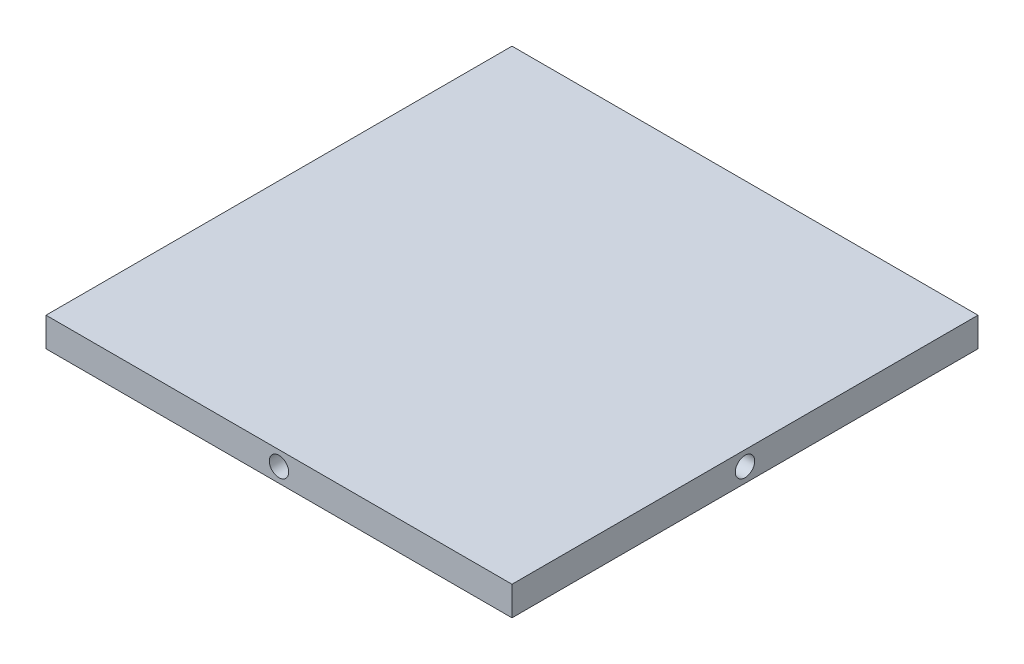
ISO-10303-21;
HEADER;
FILE_DESCRIPTION(('STEP AP214'),'2;1');
FILE_NAME('part.step','',(''),(''),'','','');
FILE_SCHEMA(('AUTOMOTIVE_DESIGN { 1 0 10303 214 1 1 1 1 }'));
ENDSEC;
DATA;
#1=APPLICATION_CONTEXT('core data for automotive mechanical design processes');
#2=APPLICATION_PROTOCOL_DEFINITION('international standard','automotive_design',2000,#1);
#3=PRODUCT_CONTEXT('',#1,'mechanical');
#4=PRODUCT('Part','Part','',(#3));
#5=PRODUCT_RELATED_PRODUCT_CATEGORY('part','',(#4));
#6=PRODUCT_DEFINITION_FORMATION('','',#4);
#7=PRODUCT_DEFINITION_CONTEXT('part definition',#1,'design');
#8=PRODUCT_DEFINITION('design','',#6,#7);
#9=PRODUCT_DEFINITION_SHAPE('','',#8);
#10=(LENGTH_UNIT() NAMED_UNIT(*) SI_UNIT(.MILLI.,.METRE.));
#11=(NAMED_UNIT(*) PLANE_ANGLE_UNIT() SI_UNIT($,.RADIAN.));
#12=(NAMED_UNIT(*) SI_UNIT($,.STERADIAN.) SOLID_ANGLE_UNIT());
#13=UNCERTAINTY_MEASURE_WITH_UNIT(LENGTH_MEASURE(1.E-05),#10,'distance_accuracy_value','');
#14=(GEOMETRIC_REPRESENTATION_CONTEXT(3) GLOBAL_UNCERTAINTY_ASSIGNED_CONTEXT((#13)) GLOBAL_UNIT_ASSIGNED_CONTEXT((#10,
#11,#12)) REPRESENTATION_CONTEXT('',''));
#15=CARTESIAN_POINT('',(0.,0.,0.));
#16=DIRECTION('',(0.,0.,1.));
#17=DIRECTION('',(1.,0.,0.));
#18=AXIS2_PLACEMENT_3D('',#15,#16,#17);
#19=CARTESIAN_POINT('',(76.2,4.7625,76.2));
#20=DIRECTION('',(-1.,0.,0.));
#21=DIRECTION('',(0.,0.,1.));
#22=AXIS2_PLACEMENT_3D('',#19,#20,#21);
#23=PLANE('',#22);
#24=CARTESIAN_POINT('',(76.2,0.,0.));
#25=DIRECTION('',(1.,0.,0.));
#26=DIRECTION('',(0.,0.,-1.));
#27=AXIS2_PLACEMENT_3D('',#24,#25,#26);
#28=CIRCLE('',#27,3.17499999999999);
#29=CARTESIAN_POINT('',(76.2,0.,-3.17499999999999));
#30=VERTEX_POINT('',#29);
#31=EDGE_CURVE('E121',#30,#30,#28,.T.);
#32=ORIENTED_EDGE('',*,*,#31,.F.);
#33=EDGE_LOOP('',(#32));
#34=FACE_BOUND('',#33,.T.);
#35=DIRECTION('',(0.,0.,-1.));
#36=VECTOR('',#35,1.);
#37=CARTESIAN_POINT('',(76.2,-4.7625,76.2));
#38=LINE('',#37,#36);
#39=CARTESIAN_POINT('',(76.2,-4.7625,76.2));
#40=VERTEX_POINT('',#39);
#41=CARTESIAN_POINT('',(76.2,-4.7625,-76.2));
#42=VERTEX_POINT('',#41);
#43=EDGE_CURVE('E127',#40,#42,#38,.T.);
#44=ORIENTED_EDGE('',*,*,#43,.T.);
#45=DIRECTION('',(0.,-1.,0.));
#46=VECTOR('',#45,1.);
#47=CARTESIAN_POINT('',(76.2,4.7625,-76.2));
#48=LINE('',#47,#46);
#49=CARTESIAN_POINT('',(76.2,4.7625,-76.2));
#50=VERTEX_POINT('',#49);
#51=EDGE_CURVE('E11',#50,#42,#48,.T.);
#52=ORIENTED_EDGE('',*,*,#51,.F.);
#53=DIRECTION('',(0.,0.,-1.));
#54=VECTOR('',#53,1.);
#55=CARTESIAN_POINT('',(76.2,4.7625,76.2));
#56=LINE('',#55,#54);
#57=CARTESIAN_POINT('',(76.2,4.7625,76.2));
#58=VERTEX_POINT('',#57);
#59=EDGE_CURVE('E128',#58,#50,#56,.T.);
#60=ORIENTED_EDGE('',*,*,#59,.F.);
#61=DIRECTION('',(0.,-1.,0.));
#62=VECTOR('',#61,1.);
#63=CARTESIAN_POINT('',(76.2,4.7625,76.2));
#64=LINE('',#63,#62);
#65=EDGE_CURVE('E134',#58,#40,#64,.T.);
#66=ORIENTED_EDGE('',*,*,#65,.T.);
#67=EDGE_LOOP('',(#44,#52,#60,#66));
#68=FACE_BOUND('',#67,.T.);
#69=ADVANCED_FACE('F34',(#34,#68),#23,.F.);
#70=CARTESIAN_POINT('',(-76.2,4.7625,-76.2));
#71=DIRECTION('',(0.,0.,1.));
#72=DIRECTION('',(1.,0.,0.));
#73=AXIS2_PLACEMENT_3D('',#70,#71,#72);
#74=PLANE('',#73);
#75=CARTESIAN_POINT('',(-2.66050878019847E-13,0.,-76.2));
#76=DIRECTION('',(0.,0.,-1.));
#77=DIRECTION('',(-1.,0.,0.));
#78=AXIS2_PLACEMENT_3D('',#75,#76,#77);
#79=CIRCLE('',#78,3.17499999999999);
#80=CARTESIAN_POINT('',(-3.17500000000025,0.,-76.2));
#81=VERTEX_POINT('',#80);
#82=EDGE_CURVE('E115',#81,#81,#79,.T.);
#83=ORIENTED_EDGE('',*,*,#82,.F.);
#84=EDGE_LOOP('',(#83));
#85=FACE_BOUND('',#84,.T.);
#86=DIRECTION('',(-1.,0.,0.));
#87=VECTOR('',#86,1.);
#88=CARTESIAN_POINT('',(-76.2,-4.7625,-76.2));
#89=LINE('',#88,#87);
#90=CARTESIAN_POINT('',(-76.2,-4.7625,-76.2));
#91=VERTEX_POINT('',#90);
#92=EDGE_CURVE('E137',#42,#91,#89,.T.);
#93=ORIENTED_EDGE('',*,*,#92,.T.);
#94=DIRECTION('',(0.,-1.,0.));
#95=VECTOR('',#94,1.);
#96=CARTESIAN_POINT('',(-76.2,4.7625,-76.2));
#97=LINE('',#96,#95);
#98=CARTESIAN_POINT('',(-76.2,4.7625,-76.2));
#99=VERTEX_POINT('',#98);
#100=EDGE_CURVE('E42',#99,#91,#97,.T.);
#101=ORIENTED_EDGE('',*,*,#100,.F.);
#102=DIRECTION('',(-1.,0.,0.));
#103=VECTOR('',#102,1.);
#104=CARTESIAN_POINT('',(-76.2,4.7625,-76.2));
#105=LINE('',#104,#103);
#106=EDGE_CURVE('E81',#50,#99,#105,.T.);
#107=ORIENTED_EDGE('',*,*,#106,.F.);
#108=ORIENTED_EDGE('',*,*,#51,.T.);
#109=EDGE_LOOP('',(#93,#101,#107,#108));
#110=FACE_BOUND('',#109,.T.);
#111=ADVANCED_FACE('F161',(#85,#110),#74,.F.);
#112=CARTESIAN_POINT('',(-76.2,4.7625,76.2));
#113=DIRECTION('',(1.,0.,0.));
#114=DIRECTION('',(0.,0.,-1.));
#115=AXIS2_PLACEMENT_3D('',#112,#113,#114);
#116=PLANE('',#115);
#117=CARTESIAN_POINT('',(-76.2,0.,0.));
#118=DIRECTION('',(-1.,0.,0.));
#119=DIRECTION('',(0.,0.,1.));
#120=AXIS2_PLACEMENT_3D('',#117,#118,#119);
#121=CIRCLE('',#120,3.17499999999999);
#122=CARTESIAN_POINT('',(-76.2,0.,3.17499999999999));
#123=VERTEX_POINT('',#122);
#124=EDGE_CURVE('E104',#123,#123,#121,.T.);
#125=ORIENTED_EDGE('',*,*,#124,.F.);
#126=EDGE_LOOP('',(#125));
#127=FACE_BOUND('',#126,.T.);
#128=DIRECTION('',(0.,0.,1.));
#129=VECTOR('',#128,1.);
#130=CARTESIAN_POINT('',(-76.2,-4.7625,76.2));
#131=LINE('',#130,#129);
#132=CARTESIAN_POINT('',(-76.2,-4.7625,76.2));
#133=VERTEX_POINT('',#132);
#134=EDGE_CURVE('E68',#91,#133,#131,.T.);
#135=ORIENTED_EDGE('',*,*,#134,.T.);
#136=DIRECTION('',(0.,-1.,0.));
#137=VECTOR('',#136,1.);
#138=CARTESIAN_POINT('',(-76.2,4.7625,76.2));
#139=LINE('',#138,#137);
#140=CARTESIAN_POINT('',(-76.2,4.7625,76.2));
#141=VERTEX_POINT('',#140);
#142=EDGE_CURVE('E142',#141,#133,#139,.T.);
#143=ORIENTED_EDGE('',*,*,#142,.F.);
#144=DIRECTION('',(0.,0.,1.));
#145=VECTOR('',#144,1.);
#146=CARTESIAN_POINT('',(-76.2,4.7625,76.2));
#147=LINE('',#146,#145);
#148=EDGE_CURVE('E131',#99,#141,#147,.T.);
#149=ORIENTED_EDGE('',*,*,#148,.F.);
#150=ORIENTED_EDGE('',*,*,#100,.T.);
#151=EDGE_LOOP('',(#135,#143,#149,#150));
#152=FACE_BOUND('',#151,.T.);
#153=ADVANCED_FACE('F144',(#127,#152),#116,.F.);
#154=CARTESIAN_POINT('',(-76.2,4.7625,76.2));
#155=DIRECTION('',(0.,0.,-1.));
#156=DIRECTION('',(-1.,0.,0.));
#157=AXIS2_PLACEMENT_3D('',#154,#155,#156);
#158=PLANE('',#157);
#159=CARTESIAN_POINT('',(7.9815263405954E-13,0.,76.2));
#160=DIRECTION('',(0.,0.,1.));
#161=DIRECTION('',(1.,0.,0.));
#162=AXIS2_PLACEMENT_3D('',#159,#160,#161);
#163=CIRCLE('',#162,3.17499999999999);
#164=CARTESIAN_POINT('',(3.17500000000079,0.,76.2));
#165=VERTEX_POINT('',#164);
#166=EDGE_CURVE('E105',#165,#165,#163,.T.);
#167=ORIENTED_EDGE('',*,*,#166,.F.);
#168=EDGE_LOOP('',(#167));
#169=FACE_BOUND('',#168,.T.);
#170=DIRECTION('',(1.,0.,0.));
#171=VECTOR('',#170,1.);
#172=CARTESIAN_POINT('',(-76.2,-4.7625,76.2));
#173=LINE('',#172,#171);
#174=EDGE_CURVE('E74',#133,#40,#173,.T.);
#175=ORIENTED_EDGE('',*,*,#174,.T.);
#176=ORIENTED_EDGE('',*,*,#65,.F.);
#177=DIRECTION('',(1.,0.,0.));
#178=VECTOR('',#177,1.);
#179=CARTESIAN_POINT('',(-76.2,4.7625,76.2));
#180=LINE('',#179,#178);
#181=EDGE_CURVE('E50',#141,#58,#180,.T.);
#182=ORIENTED_EDGE('',*,*,#181,.F.);
#183=ORIENTED_EDGE('',*,*,#142,.T.);
#184=EDGE_LOOP('',(#175,#176,#182,#183));
#185=FACE_BOUND('',#184,.T.);
#186=ADVANCED_FACE('F151',(#169,#185),#158,.F.);
#187=CARTESIAN_POINT('',(0.,4.7625,0.));
#188=DIRECTION('',(0.,-1.,0.));
#189=DIRECTION('',(0.,0.,-1.));
#190=AXIS2_PLACEMENT_3D('',#187,#188,#189);
#191=PLANE('',#190);
#192=ORIENTED_EDGE('',*,*,#59,.T.);
#193=ORIENTED_EDGE('',*,*,#106,.T.);
#194=ORIENTED_EDGE('',*,*,#148,.T.);
#195=ORIENTED_EDGE('',*,*,#181,.T.);
#196=EDGE_LOOP('',(#192,#193,#194,#195));
#197=FACE_BOUND('',#196,.T.);
#198=ADVANCED_FACE('F153',(#197),#191,.F.);
#199=CARTESIAN_POINT('',(0.,-4.7625,0.));
#200=DIRECTION('',(0.,-1.,0.));
#201=DIRECTION('',(0.,0.,-1.));
#202=AXIS2_PLACEMENT_3D('',#199,#200,#201);
#203=PLANE('',#202);
#204=ORIENTED_EDGE('',*,*,#43,.F.);
#205=ORIENTED_EDGE('',*,*,#174,.F.);
#206=ORIENTED_EDGE('',*,*,#134,.F.);
#207=ORIENTED_EDGE('',*,*,#92,.F.);
#208=EDGE_LOOP('',(#204,#205,#206,#207));
#209=FACE_BOUND('',#208,.T.);
#210=ADVANCED_FACE('F147',(#209),#203,.T.);
#211=CARTESIAN_POINT('',(63.5,0.,0.));
#212=DIRECTION('',(1.,0.,0.));
#213=DIRECTION('',(0.,0.,-1.));
#214=AXIS2_PLACEMENT_3D('',#211,#212,#213);
#215=CONICAL_SURFACE('',#214,3.17499999999999,1.02974425867665);
#216=CARTESIAN_POINT('',(61.5922675345875,0.,0.));
#217=VERTEX_POINT('',#216);
#218=VERTEX_LOOP('',#217);
#219=FACE_BOUND('',#218,.T.);
#220=CARTESIAN_POINT('',(63.5,0.,0.));
#221=DIRECTION('',(1.,0.,0.));
#222=DIRECTION('',(0.,0.,-1.));
#223=AXIS2_PLACEMENT_3D('',#220,#221,#222);
#224=CIRCLE('',#223,3.17499999999999);
#225=CARTESIAN_POINT('',(63.5,0.,-3.17499999999999));
#226=VERTEX_POINT('',#225);
#227=EDGE_CURVE('E124',#226,#226,#224,.T.);
#228=ORIENTED_EDGE('',*,*,#227,.T.);
#229=EDGE_LOOP('',(#228));
#230=FACE_BOUND('',#229,.T.);
#231=ADVANCED_FACE('F177',(#219,#230),#215,.F.);
#232=CARTESIAN_POINT('',(76.2,0.,0.));
#233=DIRECTION('',(1.,0.,0.));
#234=DIRECTION('',(0.,0.,-1.));
#235=AXIS2_PLACEMENT_3D('',#232,#233,#234);
#236=CYLINDRICAL_SURFACE('',#235,3.17499999999999);
#237=ORIENTED_EDGE('',*,*,#227,.F.);
#238=EDGE_LOOP('',(#237));
#239=FACE_BOUND('',#238,.T.);
#240=ORIENTED_EDGE('',*,*,#31,.T.);
#241=EDGE_LOOP('',(#240));
#242=FACE_BOUND('',#241,.T.);
#243=ADVANCED_FACE('F174',(#239,#242),#236,.F.);
#244=CARTESIAN_POINT('',(-2.66050878019847E-13,0.,-63.5));
#245=DIRECTION('',(0.,0.,-1.));
#246=DIRECTION('',(-1.,0.,0.));
#247=AXIS2_PLACEMENT_3D('',#244,#245,#246);
#248=CONICAL_SURFACE('',#247,3.17499999999999,1.02974425867665);
#249=CARTESIAN_POINT('',(-2.70915461486879E-13,0.,-61.5922675345875));
#250=VERTEX_POINT('',#249);
#251=VERTEX_LOOP('',#250);
#252=FACE_BOUND('',#251,.T.);
#253=CARTESIAN_POINT('',(-2.66050878019847E-13,0.,-63.5));
#254=DIRECTION('',(0.,0.,-1.));
#255=DIRECTION('',(-1.,0.,0.));
#256=AXIS2_PLACEMENT_3D('',#253,#254,#255);
#257=CIRCLE('',#256,3.17499999999999);
#258=CARTESIAN_POINT('',(-3.17500000000025,0.,-63.5));
#259=VERTEX_POINT('',#258);
#260=EDGE_CURVE('E118',#259,#259,#257,.T.);
#261=ORIENTED_EDGE('',*,*,#260,.T.);
#262=EDGE_LOOP('',(#261));
#263=FACE_BOUND('',#262,.T.);
#264=ADVANCED_FACE('F176',(#252,#263),#248,.F.);
#265=CARTESIAN_POINT('',(-2.66050878019847E-13,0.,-76.2));
#266=DIRECTION('',(0.,0.,-1.));
#267=DIRECTION('',(-1.,0.,0.));
#268=AXIS2_PLACEMENT_3D('',#265,#266,#267);
#269=CYLINDRICAL_SURFACE('',#268,3.17499999999999);
#270=ORIENTED_EDGE('',*,*,#260,.F.);
#271=EDGE_LOOP('',(#270));
#272=FACE_BOUND('',#271,.T.);
#273=ORIENTED_EDGE('',*,*,#82,.T.);
#274=EDGE_LOOP('',(#273));
#275=FACE_BOUND('',#274,.T.);
#276=ADVANCED_FACE('F184',(#272,#275),#269,.F.);
#277=CARTESIAN_POINT('',(-63.5,0.,0.));
#278=DIRECTION('',(-1.,0.,0.));
#279=DIRECTION('',(0.,0.,1.));
#280=AXIS2_PLACEMENT_3D('',#277,#278,#279);
#281=CONICAL_SURFACE('',#280,3.17499999999999,1.02974425867665);
#282=CARTESIAN_POINT('',(-61.5922675345875,0.,0.));
#283=VERTEX_POINT('',#282);
#284=VERTEX_LOOP('',#283);
#285=FACE_BOUND('',#284,.T.);
#286=CARTESIAN_POINT('',(-63.5,0.,0.));
#287=DIRECTION('',(-1.,0.,0.));
#288=DIRECTION('',(0.,0.,1.));
#289=AXIS2_PLACEMENT_3D('',#286,#287,#288);
#290=CIRCLE('',#289,3.17499999999999);
#291=CARTESIAN_POINT('',(-63.5,0.,3.17499999999999));
#292=VERTEX_POINT('',#291);
#293=EDGE_CURVE('E108',#292,#292,#290,.T.);
#294=ORIENTED_EDGE('',*,*,#293,.T.);
#295=EDGE_LOOP('',(#294));
#296=FACE_BOUND('',#295,.T.);
#297=ADVANCED_FACE('F238',(#285,#296),#281,.F.);
#298=CARTESIAN_POINT('',(-76.2,0.,0.));
#299=DIRECTION('',(-1.,0.,0.));
#300=DIRECTION('',(0.,0.,1.));
#301=AXIS2_PLACEMENT_3D('',#298,#299,#300);
#302=CYLINDRICAL_SURFACE('',#301,3.17499999999999);
#303=ORIENTED_EDGE('',*,*,#293,.F.);
#304=EDGE_LOOP('',(#303));
#305=FACE_BOUND('',#304,.T.);
#306=ORIENTED_EDGE('',*,*,#124,.T.);
#307=EDGE_LOOP('',(#306));
#308=FACE_BOUND('',#307,.T.);
#309=ADVANCED_FACE('F98',(#305,#308),#302,.F.);
#310=CARTESIAN_POINT('',(7.9815263405954E-13,0.,63.5));
#311=DIRECTION('',(0.,0.,1.));
#312=DIRECTION('',(1.,0.,0.));
#313=AXIS2_PLACEMENT_3D('',#310,#311,#312);
#314=CONICAL_SURFACE('',#313,3.17499999999999,1.02974425867665);
#315=CARTESIAN_POINT('',(7.93288050592509E-13,0.,61.5922675345875));
#316=VERTEX_POINT('',#315);
#317=VERTEX_LOOP('',#316);
#318=FACE_BOUND('',#317,.T.);
#319=CARTESIAN_POINT('',(7.9815263405954E-13,0.,63.5));
#320=DIRECTION('',(0.,0.,1.));
#321=DIRECTION('',(1.,0.,0.));
#322=AXIS2_PLACEMENT_3D('',#319,#320,#321);
#323=CIRCLE('',#322,3.17499999999999);
#324=CARTESIAN_POINT('',(3.17500000000078,0.,63.5));
#325=VERTEX_POINT('',#324);
#326=EDGE_CURVE('E102',#325,#325,#323,.T.);
#327=ORIENTED_EDGE('',*,*,#326,.T.);
#328=EDGE_LOOP('',(#327));
#329=FACE_BOUND('',#328,.T.);
#330=ADVANCED_FACE('F94',(#318,#329),#314,.F.);
#331=CARTESIAN_POINT('',(7.9815263405954E-13,0.,76.2));
#332=DIRECTION('',(0.,0.,1.));
#333=DIRECTION('',(1.,0.,0.));
#334=AXIS2_PLACEMENT_3D('',#331,#332,#333);
#335=CYLINDRICAL_SURFACE('',#334,3.17499999999999);
#336=ORIENTED_EDGE('',*,*,#326,.F.);
#337=EDGE_LOOP('',(#336));
#338=FACE_BOUND('',#337,.T.);
#339=ORIENTED_EDGE('',*,*,#166,.T.);
#340=EDGE_LOOP('',(#339));
#341=FACE_BOUND('',#340,.T.);
#342=ADVANCED_FACE('F97',(#338,#341),#335,.F.);
#343=CLOSED_SHELL('',(#69,#111,#153,#186,#198,#210,#231,#243,#264,#276,#297,#309,#330,#342));
#344=MANIFOLD_SOLID_BREP('B2',#343);
#345=ADVANCED_BREP_SHAPE_REPRESENTATION('',(#18,#344),#14);
#346=SHAPE_DEFINITION_REPRESENTATION(#9,#345);
ENDSEC;
END-ISO-10303-21;
